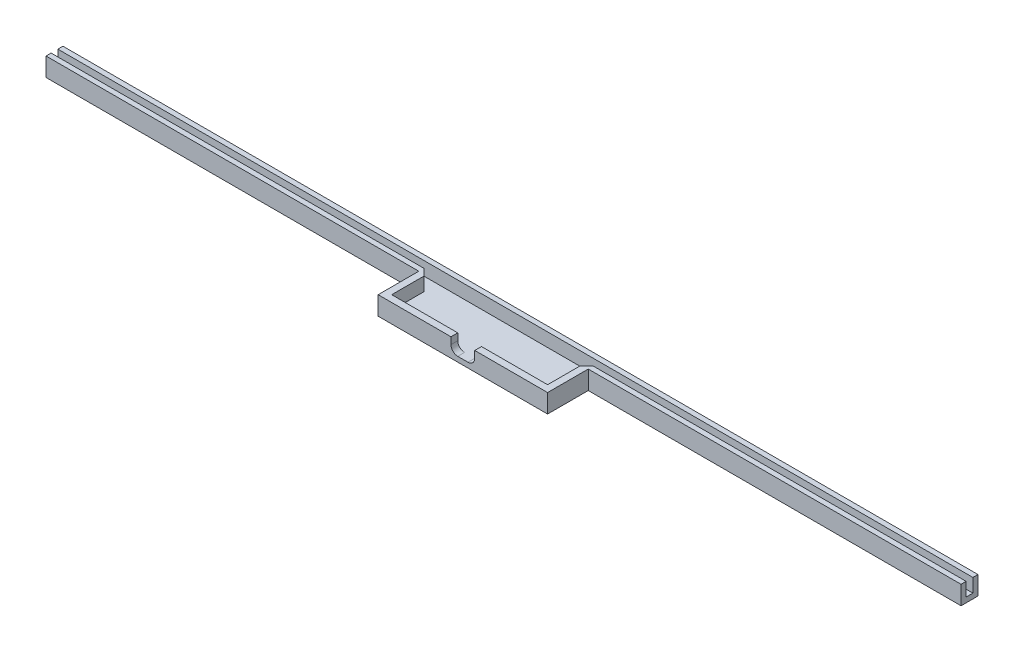
ISO-10303-21;
HEADER;
FILE_DESCRIPTION(('STEP AP214'),'2;1');
FILE_NAME('part.step','',(''),(''),'','','');
FILE_SCHEMA(('AUTOMOTIVE_DESIGN { 1 0 10303 214 1 1 1 1 }'));
ENDSEC;
DATA;
#1=APPLICATION_CONTEXT('core data for automotive mechanical design processes');
#2=APPLICATION_PROTOCOL_DEFINITION('international standard','automotive_design',2000,#1);
#3=PRODUCT_CONTEXT('',#1,'mechanical');
#4=PRODUCT('Part','Part','',(#3));
#5=PRODUCT_RELATED_PRODUCT_CATEGORY('part','',(#4));
#6=PRODUCT_DEFINITION_FORMATION('','',#4);
#7=PRODUCT_DEFINITION_CONTEXT('part definition',#1,'design');
#8=PRODUCT_DEFINITION('design','',#6,#7);
#9=PRODUCT_DEFINITION_SHAPE('','',#8);
#10=(LENGTH_UNIT() NAMED_UNIT(*) SI_UNIT(.MILLI.,.METRE.));
#11=(NAMED_UNIT(*) PLANE_ANGLE_UNIT() SI_UNIT($,.RADIAN.));
#12=(NAMED_UNIT(*) SI_UNIT($,.STERADIAN.) SOLID_ANGLE_UNIT());
#13=UNCERTAINTY_MEASURE_WITH_UNIT(LENGTH_MEASURE(1.E-05),#10,'distance_accuracy_value','');
#14=(GEOMETRIC_REPRESENTATION_CONTEXT(3) GLOBAL_UNCERTAINTY_ASSIGNED_CONTEXT((#13)) GLOBAL_UNIT_ASSIGNED_CONTEXT((#10,
#11,#12)) REPRESENTATION_CONTEXT('',''));
#15=CARTESIAN_POINT('',(0.,0.,0.));
#16=DIRECTION('',(0.,0.,1.));
#17=DIRECTION('',(1.,0.,0.));
#18=AXIS2_PLACEMENT_3D('',#15,#16,#17);
#19=CARTESIAN_POINT('',(0.,1.5,0.));
#20=DIRECTION('',(0.,-1.,0.));
#21=DIRECTION('',(0.,0.,-1.));
#22=AXIS2_PLACEMENT_3D('',#19,#20,#21);
#23=PLANE('',#22);
#24=DIRECTION('',(-1.,0.,0.));
#25=VECTOR('',#24,1.);
#26=CARTESIAN_POINT('',(-23.,1.5,6.5));
#27=LINE('',#26,#25);
#28=CARTESIAN_POINT('',(-1.5,1.5,6.5));
#29=VERTEX_POINT('',#28);
#30=CARTESIAN_POINT('',(-23.,1.5,6.5));
#31=VERTEX_POINT('',#30);
#32=EDGE_CURVE('E219',#29,#31,#27,.T.);
#33=ORIENTED_EDGE('',*,*,#32,.F.);
#34=DIRECTION('',(0.,0.,-1.));
#35=VECTOR('',#34,1.);
#36=CARTESIAN_POINT('',(-1.5,1.5,8.5));
#37=LINE('',#36,#35);
#38=CARTESIAN_POINT('',(-1.5,1.5,8.5));
#39=VERTEX_POINT('',#38);
#40=EDGE_CURVE('E372',#29,#39,#37,.F.);
#41=ORIENTED_EDGE('',*,*,#40,.T.);
#42=DIRECTION('',(1.,0.,0.));
#43=VECTOR('',#42,1.);
#44=CARTESIAN_POINT('',(-25.,1.5,8.5));
#45=LINE('',#44,#43);
#46=CARTESIAN_POINT('',(1.5,1.5,8.5));
#47=VERTEX_POINT('',#46);
#48=EDGE_CURVE('E306',#39,#47,#45,.T.);
#49=ORIENTED_EDGE('',*,*,#48,.T.);
#50=DIRECTION('',(0.,0.,1.));
#51=VECTOR('',#50,1.);
#52=CARTESIAN_POINT('',(1.5,1.5,6.5));
#53=LINE('',#52,#51);
#54=CARTESIAN_POINT('',(1.5,1.5,6.5));
#55=VERTEX_POINT('',#54);
#56=EDGE_CURVE('E369',#47,#55,#53,.F.);
#57=ORIENTED_EDGE('',*,*,#56,.T.);
#58=DIRECTION('',(-1.,0.,0.));
#59=VECTOR('',#58,1.);
#60=CARTESIAN_POINT('',(23.,1.5,6.5));
#61=LINE('',#60,#59);
#62=CARTESIAN_POINT('',(23.,1.5,6.5));
#63=VERTEX_POINT('',#62);
#64=EDGE_CURVE('E214',#63,#55,#61,.T.);
#65=ORIENTED_EDGE('',*,*,#64,.F.);
#66=DIRECTION('',(0.,0.,1.));
#67=VECTOR('',#66,1.);
#68=CARTESIAN_POINT('',(23.,1.5,-5.00000000000008));
#69=LINE('',#68,#67);
#70=CARTESIAN_POINT('',(23.,1.5,-3.00000000000011));
#71=VERTEX_POINT('',#70);
#72=EDGE_CURVE('E218',#71,#63,#69,.T.);
#73=ORIENTED_EDGE('',*,*,#72,.F.);
#74=DIRECTION('',(0.707106781186552,0.,-0.707106781186543));
#75=VECTOR('',#74,1.);
#76=CARTESIAN_POINT('',(9.99999999999978,1.5,9.99999999999992));
#77=LINE('',#76,#75);
#78=CARTESIAN_POINT('',(25.,1.5,-5.00000000000008));
#79=VERTEX_POINT('',#78);
#80=EDGE_CURVE('E362',#71,#79,#77,.T.);
#81=ORIENTED_EDGE('',*,*,#80,.T.);
#82=DIRECTION('',(1.,0.,0.));
#83=VECTOR('',#82,1.);
#84=CARTESIAN_POINT('',(135.,1.5,-5.00000000000005));
#85=LINE('',#84,#83);
#86=CARTESIAN_POINT('',(135.,1.5,-5.00000000000005));
#87=VERTEX_POINT('',#86);
#88=EDGE_CURVE('E254',#79,#87,#85,.T.);
#89=ORIENTED_EDGE('',*,*,#88,.T.);
#90=DIRECTION('',(0.,0.,-1.));
#91=VECTOR('',#90,1.);
#92=CARTESIAN_POINT('',(135.,1.5,-8.50000000000046));
#93=LINE('',#92,#91);
#94=CARTESIAN_POINT('',(135.,1.5,-7.0000000000005));
#95=VERTEX_POINT('',#94);
#96=EDGE_CURVE('E310',#87,#95,#93,.T.);
#97=ORIENTED_EDGE('',*,*,#96,.T.);
#98=DIRECTION('',(1.,0.,0.));
#99=VECTOR('',#98,1.);
#100=CARTESIAN_POINT('',(-135.,1.5,-7.00000000000045));
#101=LINE('',#100,#99);
#102=CARTESIAN_POINT('',(-135.,1.5,-7.00000000000047));
#103=VERTEX_POINT('',#102);
#104=EDGE_CURVE('E282',#103,#95,#101,.T.);
#105=ORIENTED_EDGE('',*,*,#104,.F.);
#106=DIRECTION('',(0.,0.,1.));
#107=VECTOR('',#106,1.);
#108=CARTESIAN_POINT('',(-135.,1.5,-8.50000000000047));
#109=LINE('',#108,#107);
#110=CARTESIAN_POINT('',(-135.,1.5,-5.00000000000008));
#111=VERTEX_POINT('',#110);
#112=EDGE_CURVE('E303',#103,#111,#109,.T.);
#113=ORIENTED_EDGE('',*,*,#112,.T.);
#114=DIRECTION('',(-1.,0.,0.));
#115=VECTOR('',#114,1.);
#116=CARTESIAN_POINT('',(-135.,1.5,-5.00000000000005));
#117=LINE('',#116,#115);
#118=CARTESIAN_POINT('',(-25.,1.5,-5.00000000000008));
#119=VERTEX_POINT('',#118);
#120=EDGE_CURVE('E269',#119,#111,#117,.T.);
#121=ORIENTED_EDGE('',*,*,#120,.F.);
#122=DIRECTION('',(-0.707106781186542,0.,-0.707106781186553));
#123=VECTOR('',#122,1.);
#124=CARTESIAN_POINT('',(-10.0000000000001,1.5,9.99999999999998));
#125=LINE('',#124,#123);
#126=CARTESIAN_POINT('',(-23.,1.5,-3.00000000000008));
#127=VERTEX_POINT('',#126);
#128=EDGE_CURVE('E364',#119,#127,#125,.F.);
#129=ORIENTED_EDGE('',*,*,#128,.T.);
#130=DIRECTION('',(0.,0.,-1.));
#131=VECTOR('',#130,1.);
#132=CARTESIAN_POINT('',(-23.,1.5,-5.00000000000008));
#133=LINE('',#132,#131);
#134=EDGE_CURVE('E244',#31,#127,#133,.T.);
#135=ORIENTED_EDGE('',*,*,#134,.F.);
#136=EDGE_LOOP('',(#33,#41,#49,#57,#65,#73,#81,#89,#97,#105,#113,#121,#129,#135));
#137=FACE_BOUND('',#136,.T.);
#138=ADVANCED_FACE('F33',(#137),#23,.F.);
#139=CARTESIAN_POINT('',(23.,5.5,-5.00000000000008));
#140=DIRECTION('',(1.,0.,0.));
#141=DIRECTION('',(0.,0.,-1.));
#142=AXIS2_PLACEMENT_3D('',#139,#140,#141);
#143=PLANE('',#142);
#144=DIRECTION('',(0.,0.,1.));
#145=VECTOR('',#144,1.);
#146=CARTESIAN_POINT('',(23.,5.5,-5.00000000000008));
#147=LINE('',#146,#145);
#148=CARTESIAN_POINT('',(23.,5.5,-3.00000000000011));
#149=VERTEX_POINT('',#148);
#150=CARTESIAN_POINT('',(23.,5.5,6.5));
#151=VERTEX_POINT('',#150);
#152=EDGE_CURVE('E192',#149,#151,#147,.T.);
#153=ORIENTED_EDGE('',*,*,#152,.F.);
#154=DIRECTION('',(0.,-1.,0.));
#155=VECTOR('',#154,1.);
#156=CARTESIAN_POINT('',(23.,1.5,-3.00000000000011));
#157=LINE('',#156,#155);
#158=EDGE_CURVE('E350',#149,#71,#157,.T.);
#159=ORIENTED_EDGE('',*,*,#158,.T.);
#160=ORIENTED_EDGE('',*,*,#72,.T.);
#161=DIRECTION('',(0.,-1.,0.));
#162=VECTOR('',#161,1.);
#163=CARTESIAN_POINT('',(23.,5.5,6.5));
#164=LINE('',#163,#162);
#165=EDGE_CURVE('E209',#151,#63,#164,.T.);
#166=ORIENTED_EDGE('',*,*,#165,.F.);
#167=EDGE_LOOP('',(#153,#159,#160,#166));
#168=FACE_BOUND('',#167,.T.);
#169=ADVANCED_FACE('F216',(#168),#143,.F.);
#170=CARTESIAN_POINT('',(-23.,5.5,-5.00000000000008));
#171=DIRECTION('',(-1.,0.,0.));
#172=DIRECTION('',(0.,0.,1.));
#173=AXIS2_PLACEMENT_3D('',#170,#171,#172);
#174=PLANE('',#173);
#175=ORIENTED_EDGE('',*,*,#134,.T.);
#176=DIRECTION('',(0.,1.,0.));
#177=VECTOR('',#176,1.);
#178=CARTESIAN_POINT('',(-23.,5.5,-3.00000000000008));
#179=LINE('',#178,#177);
#180=CARTESIAN_POINT('',(-23.,5.5,-3.00000000000008));
#181=VERTEX_POINT('',#180);
#182=EDGE_CURVE('E358',#127,#181,#179,.T.);
#183=ORIENTED_EDGE('',*,*,#182,.T.);
#184=DIRECTION('',(0.,0.,-1.));
#185=VECTOR('',#184,1.);
#186=CARTESIAN_POINT('',(-23.,5.5,-5.00000000000008));
#187=LINE('',#186,#185);
#188=CARTESIAN_POINT('',(-23.,5.5,6.5));
#189=VERTEX_POINT('',#188);
#190=EDGE_CURVE('E251',#189,#181,#187,.T.);
#191=ORIENTED_EDGE('',*,*,#190,.F.);
#192=DIRECTION('',(0.,-1.,0.));
#193=VECTOR('',#192,1.);
#194=CARTESIAN_POINT('',(-23.,5.5,6.5));
#195=LINE('',#194,#193);
#196=EDGE_CURVE('E230',#189,#31,#195,.T.);
#197=ORIENTED_EDGE('',*,*,#196,.T.);
#198=EDGE_LOOP('',(#175,#183,#191,#197));
#199=FACE_BOUND('',#198,.T.);
#200=ADVANCED_FACE('F417',(#199),#174,.F.);
#201=CARTESIAN_POINT('',(-135.,1.5,-8.50000000000047));
#202=DIRECTION('',(1.,0.,0.));
#203=DIRECTION('',(0.,0.,-1.));
#204=AXIS2_PLACEMENT_3D('',#201,#202,#203);
#205=PLANE('',#204);
#206=DIRECTION('',(0.,-1.,0.));
#207=VECTOR('',#206,1.);
#208=CARTESIAN_POINT('',(-135.,1.5,-8.50000000000047));
#209=LINE('',#208,#207);
#210=CARTESIAN_POINT('',(-135.,5.5,-8.50000000000047));
#211=VERTEX_POINT('',#210);
#212=CARTESIAN_POINT('',(-135.,0.,-8.50000000000047));
#213=VERTEX_POINT('',#212);
#214=EDGE_CURVE('E348',#211,#213,#209,.T.);
#215=ORIENTED_EDGE('',*,*,#214,.T.);
#216=DIRECTION('',(0.,0.,1.));
#217=VECTOR('',#216,1.);
#218=CARTESIAN_POINT('',(-135.,0.,-8.50000000000047));
#219=LINE('',#218,#217);
#220=CARTESIAN_POINT('',(-135.,0.,-3.50000000000047));
#221=VERTEX_POINT('',#220);
#222=EDGE_CURVE('E302',#213,#221,#219,.T.);
#223=ORIENTED_EDGE('',*,*,#222,.T.);
#224=DIRECTION('',(0.,-1.,0.));
#225=VECTOR('',#224,1.);
#226=CARTESIAN_POINT('',(-135.,1.5,-3.50000000000047));
#227=LINE('',#226,#225);
#228=CARTESIAN_POINT('',(-135.,5.5,-3.50000000000047));
#229=VERTEX_POINT('',#228);
#230=EDGE_CURVE('E345',#229,#221,#227,.T.);
#231=ORIENTED_EDGE('',*,*,#230,.F.);
#232=DIRECTION('',(0.,0.,1.));
#233=VECTOR('',#232,1.);
#234=CARTESIAN_POINT('',(-135.,5.5,-5.00000000000005));
#235=LINE('',#234,#233);
#236=CARTESIAN_POINT('',(-135.,5.5,-5.00000000000005));
#237=VERTEX_POINT('',#236);
#238=EDGE_CURVE('E270',#237,#229,#235,.T.);
#239=ORIENTED_EDGE('',*,*,#238,.F.);
#240=DIRECTION('',(0.,-1.,0.));
#241=VECTOR('',#240,1.);
#242=CARTESIAN_POINT('',(-135.,5.5,-5.00000000000005));
#243=LINE('',#242,#241);
#244=EDGE_CURVE('E278',#237,#111,#243,.T.);
#245=ORIENTED_EDGE('',*,*,#244,.T.);
#246=ORIENTED_EDGE('',*,*,#112,.F.);
#247=DIRECTION('',(0.,-1.,0.));
#248=VECTOR('',#247,1.);
#249=CARTESIAN_POINT('',(-135.,5.5,-7.00000000000045));
#250=LINE('',#249,#248);
#251=CARTESIAN_POINT('',(-135.,5.5,-7.00000000000045));
#252=VERTEX_POINT('',#251);
#253=EDGE_CURVE('E299',#252,#103,#250,.T.);
#254=ORIENTED_EDGE('',*,*,#253,.F.);
#255=DIRECTION('',(0.,0.,1.));
#256=VECTOR('',#255,1.);
#257=CARTESIAN_POINT('',(-135.,5.5,-8.50000000000047));
#258=LINE('',#257,#256);
#259=EDGE_CURVE('E283',#211,#252,#258,.T.);
#260=ORIENTED_EDGE('',*,*,#259,.F.);
#261=EDGE_LOOP('',(#215,#223,#231,#239,#245,#246,#254,#260));
#262=FACE_BOUND('',#261,.T.);
#263=ADVANCED_FACE('F451',(#262),#205,.F.);
#264=CARTESIAN_POINT('',(-135.,1.5,-3.50000000000047));
#265=DIRECTION('',(0.,0.,-1.));
#266=DIRECTION('',(-1.,0.,0.));
#267=AXIS2_PLACEMENT_3D('',#264,#265,#266);
#268=PLANE('',#267);
#269=DIRECTION('',(1.,0.,0.));
#270=VECTOR('',#269,1.);
#271=CARTESIAN_POINT('',(-135.,0.,-3.50000000000047));
#272=LINE('',#271,#270);
#273=CARTESIAN_POINT('',(-25.,0.,-3.50000000000006));
#274=VERTEX_POINT('',#273);
#275=EDGE_CURVE('E314',#221,#274,#272,.T.);
#276=ORIENTED_EDGE('',*,*,#275,.T.);
#277=DIRECTION('',(0.,-1.,0.));
#278=VECTOR('',#277,1.);
#279=CARTESIAN_POINT('',(-25.,1.5,-3.50000000000006));
#280=LINE('',#279,#278);
#281=CARTESIAN_POINT('',(-25.,5.5,-3.50000000000006));
#282=VERTEX_POINT('',#281);
#283=EDGE_CURVE('E342',#282,#274,#280,.T.);
#284=ORIENTED_EDGE('',*,*,#283,.F.);
#285=DIRECTION('',(1.,0.,0.));
#286=VECTOR('',#285,1.);
#287=CARTESIAN_POINT('',(-25.,5.5,-3.50000000000006));
#288=LINE('',#287,#286);
#289=EDGE_CURVE('E273',#229,#282,#288,.T.);
#290=ORIENTED_EDGE('',*,*,#289,.F.);
#291=ORIENTED_EDGE('',*,*,#230,.T.);
#292=EDGE_LOOP('',(#276,#284,#290,#291));
#293=FACE_BOUND('',#292,.T.);
#294=ADVANCED_FACE('F448',(#293),#268,.F.);
#295=CARTESIAN_POINT('',(-25.,1.5,8.5));
#296=DIRECTION('',(1.,0.,0.));
#297=DIRECTION('',(0.,0.,-1.));
#298=AXIS2_PLACEMENT_3D('',#295,#296,#297);
#299=PLANE('',#298);
#300=DIRECTION('',(0.,0.,1.));
#301=VECTOR('',#300,1.);
#302=CARTESIAN_POINT('',(-25.,0.,8.5));
#303=LINE('',#302,#301);
#304=CARTESIAN_POINT('',(-25.,0.,8.5));
#305=VERTEX_POINT('',#304);
#306=EDGE_CURVE('E316',#274,#305,#303,.T.);
#307=ORIENTED_EDGE('',*,*,#306,.T.);
#308=DIRECTION('',(0.,-1.,0.));
#309=VECTOR('',#308,1.);
#310=CARTESIAN_POINT('',(-25.,1.5,8.5));
#311=LINE('',#310,#309);
#312=CARTESIAN_POINT('',(-25.,5.5,8.5));
#313=VERTEX_POINT('',#312);
#314=EDGE_CURVE('E339',#313,#305,#311,.T.);
#315=ORIENTED_EDGE('',*,*,#314,.F.);
#316=DIRECTION('',(0.,0.,1.));
#317=VECTOR('',#316,1.);
#318=CARTESIAN_POINT('',(-25.,5.5,-5.00000000000008));
#319=LINE('',#318,#317);
#320=EDGE_CURVE('E246',#282,#313,#319,.T.);
#321=ORIENTED_EDGE('',*,*,#320,.F.);
#322=ORIENTED_EDGE('',*,*,#283,.T.);
#323=EDGE_LOOP('',(#307,#315,#321,#322));
#324=FACE_BOUND('',#323,.T.);
#325=ADVANCED_FACE('F445',(#324),#299,.F.);
#326=CARTESIAN_POINT('',(-25.,1.5,8.5));
#327=DIRECTION('',(0.,0.,-1.));
#328=DIRECTION('',(-1.,0.,0.));
#329=AXIS2_PLACEMENT_3D('',#326,#327,#328);
#330=PLANE('',#329);
#331=ORIENTED_EDGE('',*,*,#48,.F.);
#332=CARTESIAN_POINT('',(-1.5,3.5,8.5));
#333=DIRECTION('',(0.,0.,-1.));
#334=DIRECTION('',(-1.,0.,0.));
#335=AXIS2_PLACEMENT_3D('',#332,#333,#334);
#336=CIRCLE('',#335,2.);
#337=CARTESIAN_POINT('',(-3.5,3.5,8.5));
#338=VERTEX_POINT('',#337);
#339=EDGE_CURVE('E379',#39,#338,#336,.T.);
#340=ORIENTED_EDGE('',*,*,#339,.T.);
#341=DIRECTION('',(0.,-1.,0.));
#342=VECTOR('',#341,1.);
#343=CARTESIAN_POINT('',(-3.5,5.5,8.5));
#344=LINE('',#343,#342);
#345=CARTESIAN_POINT('',(-3.5,5.5,8.5));
#346=VERTEX_POINT('',#345);
#347=EDGE_CURVE('E237',#346,#338,#344,.T.);
#348=ORIENTED_EDGE('',*,*,#347,.F.);
#349=DIRECTION('',(1.,0.,0.));
#350=VECTOR('',#349,1.);
#351=CARTESIAN_POINT('',(-25.,5.5,8.5));
#352=LINE('',#351,#350);
#353=EDGE_CURVE('E249',#313,#346,#352,.T.);
#354=ORIENTED_EDGE('',*,*,#353,.F.);
#355=ORIENTED_EDGE('',*,*,#314,.T.);
#356=DIRECTION('',(1.,0.,0.));
#357=VECTOR('',#356,1.);
#358=CARTESIAN_POINT('',(-25.,0.,8.5));
#359=LINE('',#358,#357);
#360=CARTESIAN_POINT('',(25.,0.,8.5));
#361=VERTEX_POINT('',#360);
#362=EDGE_CURVE('E318',#305,#361,#359,.T.);
#363=ORIENTED_EDGE('',*,*,#362,.T.);
#364=DIRECTION('',(0.,-1.,0.));
#365=VECTOR('',#364,1.);
#366=CARTESIAN_POINT('',(25.,1.5,8.5));
#367=LINE('',#366,#365);
#368=CARTESIAN_POINT('',(25.,5.5,8.5));
#369=VERTEX_POINT('',#368);
#370=EDGE_CURVE('E336',#369,#361,#367,.T.);
#371=ORIENTED_EDGE('',*,*,#370,.F.);
#372=DIRECTION('',(1.,0.,0.));
#373=VECTOR('',#372,1.);
#374=CARTESIAN_POINT('',(25.,5.5,8.5));
#375=LINE('',#374,#373);
#376=CARTESIAN_POINT('',(3.5,5.5,8.5));
#377=VERTEX_POINT('',#376);
#378=EDGE_CURVE('E204',#377,#369,#375,.T.);
#379=ORIENTED_EDGE('',*,*,#378,.F.);
#380=DIRECTION('',(0.,-1.,0.));
#381=VECTOR('',#380,1.);
#382=CARTESIAN_POINT('',(3.5,5.5,8.5));
#383=LINE('',#382,#381);
#384=CARTESIAN_POINT('',(3.5,3.5,8.5));
#385=VERTEX_POINT('',#384);
#386=EDGE_CURVE('E223',#377,#385,#383,.T.);
#387=ORIENTED_EDGE('',*,*,#386,.T.);
#388=CARTESIAN_POINT('',(1.5,3.5,8.5));
#389=DIRECTION('',(0.,0.,-1.));
#390=DIRECTION('',(-1.,0.,0.));
#391=AXIS2_PLACEMENT_3D('',#388,#389,#390);
#392=CIRCLE('',#391,2.);
#393=EDGE_CURVE('E41',#385,#47,#392,.T.);
#394=ORIENTED_EDGE('',*,*,#393,.T.);
#395=EDGE_LOOP('',(#331,#340,#348,#354,#355,#363,#371,#379,#387,#394));
#396=FACE_BOUND('',#395,.T.);
#397=ADVANCED_FACE('F383',(#396),#330,.F.);
#398=CARTESIAN_POINT('',(25.,1.5,8.5));
#399=DIRECTION('',(-1.,0.,0.));
#400=DIRECTION('',(0.,0.,1.));
#401=AXIS2_PLACEMENT_3D('',#398,#399,#400);
#402=PLANE('',#401);
#403=DIRECTION('',(0.,0.,-1.));
#404=VECTOR('',#403,1.);
#405=CARTESIAN_POINT('',(25.,0.,8.5));
#406=LINE('',#405,#404);
#407=CARTESIAN_POINT('',(25.,0.,-3.50000000000005));
#408=VERTEX_POINT('',#407);
#409=EDGE_CURVE('E320',#361,#408,#406,.T.);
#410=ORIENTED_EDGE('',*,*,#409,.T.);
#411=DIRECTION('',(0.,-1.,0.));
#412=VECTOR('',#411,1.);
#413=CARTESIAN_POINT('',(25.,1.5,-3.50000000000005));
#414=LINE('',#413,#412);
#415=CARTESIAN_POINT('',(25.,5.5,-3.50000000000006));
#416=VERTEX_POINT('',#415);
#417=EDGE_CURVE('E333',#416,#408,#414,.T.);
#418=ORIENTED_EDGE('',*,*,#417,.F.);
#419=DIRECTION('',(0.,0.,-1.));
#420=VECTOR('',#419,1.);
#421=CARTESIAN_POINT('',(25.,5.5,-5.00000000000008));
#422=LINE('',#421,#420);
#423=EDGE_CURVE('E205',#369,#416,#422,.T.);
#424=ORIENTED_EDGE('',*,*,#423,.F.);
#425=ORIENTED_EDGE('',*,*,#370,.T.);
#426=EDGE_LOOP('',(#410,#418,#424,#425));
#427=FACE_BOUND('',#426,.T.);
#428=ADVANCED_FACE('F438',(#427),#402,.F.);
#429=CARTESIAN_POINT('',(135.,1.5,-3.50000000000046));
#430=DIRECTION('',(0.,0.,-1.));
#431=DIRECTION('',(-1.,0.,0.));
#432=AXIS2_PLACEMENT_3D('',#429,#430,#431);
#433=PLANE('',#432);
#434=DIRECTION('',(1.,0.,0.));
#435=VECTOR('',#434,1.);
#436=CARTESIAN_POINT('',(135.,0.,-3.50000000000046));
#437=LINE('',#436,#435);
#438=CARTESIAN_POINT('',(135.,0.,-3.50000000000046));
#439=VERTEX_POINT('',#438);
#440=EDGE_CURVE('E322',#408,#439,#437,.T.);
#441=ORIENTED_EDGE('',*,*,#440,.T.);
#442=DIRECTION('',(0.,-1.,0.));
#443=VECTOR('',#442,1.);
#444=CARTESIAN_POINT('',(135.,1.5,-3.50000000000046));
#445=LINE('',#444,#443);
#446=CARTESIAN_POINT('',(135.,5.5,-3.50000000000047));
#447=VERTEX_POINT('',#446);
#448=EDGE_CURVE('E330',#447,#439,#445,.T.);
#449=ORIENTED_EDGE('',*,*,#448,.F.);
#450=DIRECTION('',(-1.,0.,0.));
#451=VECTOR('',#450,1.);
#452=CARTESIAN_POINT('',(25.,5.5,-3.50000000000006));
#453=LINE('',#452,#451);
#454=EDGE_CURVE('E262',#447,#416,#453,.T.);
#455=ORIENTED_EDGE('',*,*,#454,.T.);
#456=ORIENTED_EDGE('',*,*,#417,.T.);
#457=EDGE_LOOP('',(#441,#449,#455,#456));
#458=FACE_BOUND('',#457,.T.);
#459=ADVANCED_FACE('F434',(#458),#433,.F.);
#460=CARTESIAN_POINT('',(135.,1.5,-8.50000000000046));
#461=DIRECTION('',(-1.,0.,0.));
#462=DIRECTION('',(0.,0.,1.));
#463=AXIS2_PLACEMENT_3D('',#460,#461,#462);
#464=PLANE('',#463);
#465=DIRECTION('',(0.,-1.,0.));
#466=VECTOR('',#465,1.);
#467=CARTESIAN_POINT('',(135.,5.5,-7.0000000000005));
#468=LINE('',#467,#466);
#469=CARTESIAN_POINT('',(135.,5.5,-7.0000000000005));
#470=VERTEX_POINT('',#469);
#471=EDGE_CURVE('E294',#470,#95,#468,.T.);
#472=ORIENTED_EDGE('',*,*,#471,.T.);
#473=ORIENTED_EDGE('',*,*,#96,.F.);
#474=DIRECTION('',(0.,-1.,0.));
#475=VECTOR('',#474,1.);
#476=CARTESIAN_POINT('',(135.,5.5,-5.00000000000005));
#477=LINE('',#476,#475);
#478=CARTESIAN_POINT('',(135.,5.5,-5.00000000000005));
#479=VERTEX_POINT('',#478);
#480=EDGE_CURVE('E265',#479,#87,#477,.T.);
#481=ORIENTED_EDGE('',*,*,#480,.F.);
#482=DIRECTION('',(0.,0.,1.));
#483=VECTOR('',#482,1.);
#484=CARTESIAN_POINT('',(135.,5.5,-5.00000000000005));
#485=LINE('',#484,#483);
#486=EDGE_CURVE('E257',#479,#447,#485,.T.);
#487=ORIENTED_EDGE('',*,*,#486,.T.);
#488=ORIENTED_EDGE('',*,*,#448,.T.);
#489=DIRECTION('',(0.,0.,-1.));
#490=VECTOR('',#489,1.);
#491=CARTESIAN_POINT('',(135.,0.,-8.50000000000046));
#492=LINE('',#491,#490);
#493=CARTESIAN_POINT('',(135.,0.,-8.50000000000046));
#494=VERTEX_POINT('',#493);
#495=EDGE_CURVE('E324',#439,#494,#492,.T.);
#496=ORIENTED_EDGE('',*,*,#495,.T.);
#497=DIRECTION('',(0.,-1.,0.));
#498=VECTOR('',#497,1.);
#499=CARTESIAN_POINT('',(135.,1.5,-8.50000000000046));
#500=LINE('',#499,#498);
#501=CARTESIAN_POINT('',(135.,5.5,-8.50000000000046));
#502=VERTEX_POINT('',#501);
#503=EDGE_CURVE('E312',#502,#494,#500,.T.);
#504=ORIENTED_EDGE('',*,*,#503,.F.);
#505=DIRECTION('',(0.,0.,-1.));
#506=VECTOR('',#505,1.);
#507=CARTESIAN_POINT('',(135.,5.5,-7.0000000000005));
#508=LINE('',#507,#506);
#509=EDGE_CURVE('E288',#470,#502,#508,.T.);
#510=ORIENTED_EDGE('',*,*,#509,.F.);
#511=EDGE_LOOP('',(#472,#473,#481,#487,#488,#496,#504,#510));
#512=FACE_BOUND('',#511,.T.);
#513=ADVANCED_FACE('F430',(#512),#464,.F.);
#514=CARTESIAN_POINT('',(25.,1.5,-8.5));
#515=DIRECTION('',(0.,0.,1.));
#516=DIRECTION('',(1.,0.,0.));
#517=AXIS2_PLACEMENT_3D('',#514,#515,#516);
#518=PLANE('',#517);
#519=ORIENTED_EDGE('',*,*,#503,.T.);
#520=DIRECTION('',(-1.,0.,0.));
#521=VECTOR('',#520,1.);
#522=CARTESIAN_POINT('',(25.,0.,-8.5));
#523=LINE('',#522,#521);
#524=EDGE_CURVE('E307',#494,#213,#523,.T.);
#525=ORIENTED_EDGE('',*,*,#524,.T.);
#526=ORIENTED_EDGE('',*,*,#214,.F.);
#527=DIRECTION('',(-1.,0.,0.));
#528=VECTOR('',#527,1.);
#529=CARTESIAN_POINT('',(135.,5.5,-8.50000000000046));
#530=LINE('',#529,#528);
#531=EDGE_CURVE('E291',#502,#211,#530,.T.);
#532=ORIENTED_EDGE('',*,*,#531,.F.);
#533=EDGE_LOOP('',(#519,#525,#526,#532));
#534=FACE_BOUND('',#533,.T.);
#535=ADVANCED_FACE('F426',(#534),#518,.F.);
#536=CARTESIAN_POINT('',(0.,0.,0.));
#537=DIRECTION('',(0.,-1.,0.));
#538=DIRECTION('',(0.,0.,-1.));
#539=AXIS2_PLACEMENT_3D('',#536,#537,#538);
#540=PLANE('',#539);
#541=ORIENTED_EDGE('',*,*,#222,.F.);
#542=ORIENTED_EDGE('',*,*,#524,.F.);
#543=ORIENTED_EDGE('',*,*,#495,.F.);
#544=ORIENTED_EDGE('',*,*,#440,.F.);
#545=ORIENTED_EDGE('',*,*,#409,.F.);
#546=ORIENTED_EDGE('',*,*,#362,.F.);
#547=ORIENTED_EDGE('',*,*,#306,.F.);
#548=ORIENTED_EDGE('',*,*,#275,.F.);
#549=EDGE_LOOP('',(#541,#542,#543,#544,#545,#546,#547,#548));
#550=FACE_BOUND('',#549,.T.);
#551=ADVANCED_FACE('F423',(#550),#540,.T.);
#552=CARTESIAN_POINT('',(-135.,5.5,-7.00000000000045));
#553=DIRECTION('',(0.,0.,-1.));
#554=DIRECTION('',(-1.,0.,0.));
#555=AXIS2_PLACEMENT_3D('',#552,#553,#554);
#556=PLANE('',#555);
#557=ORIENTED_EDGE('',*,*,#104,.T.);
#558=ORIENTED_EDGE('',*,*,#471,.F.);
#559=DIRECTION('',(1.,0.,0.));
#560=VECTOR('',#559,1.);
#561=CARTESIAN_POINT('',(-135.,5.5,-7.00000000000045));
#562=LINE('',#561,#560);
#563=EDGE_CURVE('E286',#252,#470,#562,.T.);
#564=ORIENTED_EDGE('',*,*,#563,.F.);
#565=ORIENTED_EDGE('',*,*,#253,.T.);
#566=EDGE_LOOP('',(#557,#558,#564,#565));
#567=FACE_BOUND('',#566,.T.);
#568=ADVANCED_FACE('F421',(#567),#556,.F.);
#569=CARTESIAN_POINT('',(0.,5.5,0.));
#570=DIRECTION('',(0.,1.,0.));
#571=DIRECTION('',(0.,0.,1.));
#572=AXIS2_PLACEMENT_3D('',#569,#570,#571);
#573=PLANE('',#572);
#574=ORIENTED_EDGE('',*,*,#259,.T.);
#575=ORIENTED_EDGE('',*,*,#563,.T.);
#576=ORIENTED_EDGE('',*,*,#509,.T.);
#577=ORIENTED_EDGE('',*,*,#531,.T.);
#578=EDGE_LOOP('',(#574,#575,#576,#577));
#579=FACE_BOUND('',#578,.T.);
#580=ADVANCED_FACE('F486',(#579),#573,.T.);
#581=CARTESIAN_POINT('',(-135.,5.5,-5.00000000000005));
#582=DIRECTION('',(0.,0.,1.));
#583=DIRECTION('',(1.,0.,0.));
#584=AXIS2_PLACEMENT_3D('',#581,#582,#583);
#585=PLANE('',#584);
#586=DIRECTION('',(-1.,0.,0.));
#587=VECTOR('',#586,1.);
#588=CARTESIAN_POINT('',(-135.,5.5,-5.00000000000005));
#589=LINE('',#588,#587);
#590=CARTESIAN_POINT('',(-25.,5.5,-5.00000000000008));
#591=VERTEX_POINT('',#590);
#592=EDGE_CURVE('E276',#591,#237,#589,.T.);
#593=ORIENTED_EDGE('',*,*,#592,.F.);
#594=DIRECTION('',(0.,-1.,0.));
#595=VECTOR('',#594,1.);
#596=CARTESIAN_POINT('',(-25.,5.5,-5.00000000000008));
#597=LINE('',#596,#595);
#598=EDGE_CURVE('E355',#591,#119,#597,.T.);
#599=ORIENTED_EDGE('',*,*,#598,.T.);
#600=ORIENTED_EDGE('',*,*,#120,.T.);
#601=ORIENTED_EDGE('',*,*,#244,.F.);
#602=EDGE_LOOP('',(#593,#599,#600,#601));
#603=FACE_BOUND('',#602,.T.);
#604=ADVANCED_FACE('F479',(#603),#585,.F.);
#605=CARTESIAN_POINT('',(0.,5.5,0.));
#606=DIRECTION('',(0.,-1.,0.));
#607=DIRECTION('',(0.,0.,-1.));
#608=AXIS2_PLACEMENT_3D('',#605,#606,#607);
#609=PLANE('',#608);
#610=ORIENTED_EDGE('',*,*,#190,.T.);
#611=DIRECTION('',(0.707106781186542,0.,0.707106781186553));
#612=VECTOR('',#611,1.);
#613=CARTESIAN_POINT('',(-25.,5.5,-5.00000000000008));
#614=LINE('',#613,#612);
#615=EDGE_CURVE('E360',#181,#591,#614,.F.);
#616=ORIENTED_EDGE('',*,*,#615,.T.);
#617=ORIENTED_EDGE('',*,*,#592,.T.);
#618=ORIENTED_EDGE('',*,*,#238,.T.);
#619=ORIENTED_EDGE('',*,*,#289,.T.);
#620=ORIENTED_EDGE('',*,*,#320,.T.);
#621=ORIENTED_EDGE('',*,*,#353,.T.);
#622=DIRECTION('',(0.,0.,-1.));
#623=VECTOR('',#622,1.);
#624=CARTESIAN_POINT('',(-3.5,5.5,8.5));
#625=LINE('',#624,#623);
#626=CARTESIAN_POINT('',(-3.5,5.5,6.5));
#627=VERTEX_POINT('',#626);
#628=EDGE_CURVE('E221',#346,#627,#625,.T.);
#629=ORIENTED_EDGE('',*,*,#628,.T.);
#630=DIRECTION('',(-1.,0.,0.));
#631=VECTOR('',#630,1.);
#632=CARTESIAN_POINT('',(-23.,5.5,6.5));
#633=LINE('',#632,#631);
#634=EDGE_CURVE('E228',#627,#189,#633,.T.);
#635=ORIENTED_EDGE('',*,*,#634,.T.);
#636=EDGE_LOOP('',(#610,#616,#617,#618,#619,#620,#621,#629,#635));
#637=FACE_BOUND('',#636,.T.);
#638=ADVANCED_FACE('F473',(#637),#609,.F.);
#639=CARTESIAN_POINT('',(135.,5.5,-5.00000000000005));
#640=DIRECTION('',(0.,0.,-1.));
#641=DIRECTION('',(-1.,0.,0.));
#642=AXIS2_PLACEMENT_3D('',#639,#640,#641);
#643=PLANE('',#642);
#644=ORIENTED_EDGE('',*,*,#88,.F.);
#645=DIRECTION('',(0.,1.,0.));
#646=VECTOR('',#645,1.);
#647=CARTESIAN_POINT('',(25.,5.5,-5.00000000000008));
#648=LINE('',#647,#646);
#649=CARTESIAN_POINT('',(25.,5.5,-5.00000000000008));
#650=VERTEX_POINT('',#649);
#651=EDGE_CURVE('E352',#79,#650,#648,.T.);
#652=ORIENTED_EDGE('',*,*,#651,.T.);
#653=DIRECTION('',(1.,0.,0.));
#654=VECTOR('',#653,1.);
#655=CARTESIAN_POINT('',(135.,5.5,-5.00000000000005));
#656=LINE('',#655,#654);
#657=EDGE_CURVE('E260',#650,#479,#656,.T.);
#658=ORIENTED_EDGE('',*,*,#657,.T.);
#659=ORIENTED_EDGE('',*,*,#480,.T.);
#660=EDGE_LOOP('',(#644,#652,#658,#659));
#661=FACE_BOUND('',#660,.T.);
#662=ADVANCED_FACE('F397',(#661),#643,.T.);
#663=CARTESIAN_POINT('',(0.,5.5,0.));
#664=DIRECTION('',(0.,-1.,0.));
#665=DIRECTION('',(0.,0.,-1.));
#666=AXIS2_PLACEMENT_3D('',#663,#664,#665);
#667=PLANE('',#666);
#668=ORIENTED_EDGE('',*,*,#657,.F.);
#669=DIRECTION('',(-0.707106781186552,0.,0.707106781186543));
#670=VECTOR('',#669,1.);
#671=CARTESIAN_POINT('',(23.,5.5,-3.00000000000011));
#672=LINE('',#671,#670);
#673=EDGE_CURVE('E199',#650,#149,#672,.T.);
#674=ORIENTED_EDGE('',*,*,#673,.T.);
#675=ORIENTED_EDGE('',*,*,#152,.T.);
#676=DIRECTION('',(-1.,0.,0.));
#677=VECTOR('',#676,1.);
#678=CARTESIAN_POINT('',(23.,5.5,6.5));
#679=LINE('',#678,#677);
#680=CARTESIAN_POINT('',(3.5,5.5,6.5));
#681=VERTEX_POINT('',#680);
#682=EDGE_CURVE('E197',#151,#681,#679,.T.);
#683=ORIENTED_EDGE('',*,*,#682,.T.);
#684=DIRECTION('',(0.,0.,1.));
#685=VECTOR('',#684,1.);
#686=CARTESIAN_POINT('',(3.5,5.5,8.5));
#687=LINE('',#686,#685);
#688=EDGE_CURVE('E213',#681,#377,#687,.T.);
#689=ORIENTED_EDGE('',*,*,#688,.T.);
#690=ORIENTED_EDGE('',*,*,#378,.T.);
#691=ORIENTED_EDGE('',*,*,#423,.T.);
#692=ORIENTED_EDGE('',*,*,#454,.F.);
#693=ORIENTED_EDGE('',*,*,#486,.F.);
#694=EDGE_LOOP('',(#668,#674,#675,#683,#689,#690,#691,#692,#693));
#695=FACE_BOUND('',#694,.T.);
#696=ADVANCED_FACE('F195',(#695),#667,.F.);
#697=CARTESIAN_POINT('',(-3.5,5.5,8.5));
#698=DIRECTION('',(-1.,0.,0.));
#699=DIRECTION('',(0.,0.,1.));
#700=AXIS2_PLACEMENT_3D('',#697,#698,#699);
#701=PLANE('',#700);
#702=ORIENTED_EDGE('',*,*,#347,.T.);
#703=DIRECTION('',(0.,0.,-1.));
#704=VECTOR('',#703,1.);
#705=CARTESIAN_POINT('',(-3.5,3.5,6.5));
#706=LINE('',#705,#704);
#707=CARTESIAN_POINT('',(-3.5,3.5,6.5));
#708=VERTEX_POINT('',#707);
#709=EDGE_CURVE('E366',#338,#708,#706,.T.);
#710=ORIENTED_EDGE('',*,*,#709,.T.);
#711=DIRECTION('',(0.,-1.,0.));
#712=VECTOR('',#711,1.);
#713=CARTESIAN_POINT('',(-3.5,5.5,6.5));
#714=LINE('',#713,#712);
#715=EDGE_CURVE('E234',#627,#708,#714,.T.);
#716=ORIENTED_EDGE('',*,*,#715,.F.);
#717=ORIENTED_EDGE('',*,*,#628,.F.);
#718=EDGE_LOOP('',(#702,#710,#716,#717));
#719=FACE_BOUND('',#718,.T.);
#720=ADVANCED_FACE('F499',(#719),#701,.F.);
#721=CARTESIAN_POINT('',(-23.,5.5,6.5));
#722=DIRECTION('',(0.,0.,1.));
#723=DIRECTION('',(1.,0.,0.));
#724=AXIS2_PLACEMENT_3D('',#721,#722,#723);
#725=PLANE('',#724);
#726=ORIENTED_EDGE('',*,*,#32,.T.);
#727=ORIENTED_EDGE('',*,*,#196,.F.);
#728=ORIENTED_EDGE('',*,*,#634,.F.);
#729=ORIENTED_EDGE('',*,*,#715,.T.);
#730=CARTESIAN_POINT('',(-1.5,3.5,6.5));
#731=DIRECTION('',(0.,0.,1.));
#732=DIRECTION('',(1.,0.,0.));
#733=AXIS2_PLACEMENT_3D('',#730,#731,#732);
#734=CIRCLE('',#733,2.);
#735=EDGE_CURVE('E376',#708,#29,#734,.T.);
#736=ORIENTED_EDGE('',*,*,#735,.T.);
#737=EDGE_LOOP('',(#726,#727,#728,#729,#736));
#738=FACE_BOUND('',#737,.T.);
#739=ADVANCED_FACE('F503',(#738),#725,.F.);
#740=CARTESIAN_POINT('',(23.,5.5,6.5));
#741=DIRECTION('',(0.,0.,1.));
#742=DIRECTION('',(1.,0.,0.));
#743=AXIS2_PLACEMENT_3D('',#740,#741,#742);
#744=PLANE('',#743);
#745=ORIENTED_EDGE('',*,*,#64,.T.);
#746=CARTESIAN_POINT('',(1.5,3.5,6.5));
#747=DIRECTION('',(0.,0.,1.));
#748=DIRECTION('',(1.,0.,0.));
#749=AXIS2_PLACEMENT_3D('',#746,#747,#748);
#750=CIRCLE('',#749,2.);
#751=CARTESIAN_POINT('',(3.5,3.5,6.5));
#752=VERTEX_POINT('',#751);
#753=EDGE_CURVE('E11',#55,#752,#750,.T.);
#754=ORIENTED_EDGE('',*,*,#753,.T.);
#755=DIRECTION('',(0.,-1.,0.));
#756=VECTOR('',#755,1.);
#757=CARTESIAN_POINT('',(3.5,5.5,6.5));
#758=LINE('',#757,#756);
#759=EDGE_CURVE('E211',#681,#752,#758,.T.);
#760=ORIENTED_EDGE('',*,*,#759,.F.);
#761=ORIENTED_EDGE('',*,*,#682,.F.);
#762=ORIENTED_EDGE('',*,*,#165,.T.);
#763=EDGE_LOOP('',(#745,#754,#760,#761,#762));
#764=FACE_BOUND('',#763,.T.);
#765=ADVANCED_FACE('F208',(#764),#744,.F.);
#766=CARTESIAN_POINT('',(3.5,5.5,8.5));
#767=DIRECTION('',(1.,0.,0.));
#768=DIRECTION('',(0.,0.,-1.));
#769=AXIS2_PLACEMENT_3D('',#766,#767,#768);
#770=PLANE('',#769);
#771=ORIENTED_EDGE('',*,*,#759,.T.);
#772=DIRECTION('',(0.,0.,1.));
#773=VECTOR('',#772,1.);
#774=CARTESIAN_POINT('',(3.5,3.5,8.5));
#775=LINE('',#774,#773);
#776=EDGE_CURVE('E374',#752,#385,#775,.T.);
#777=ORIENTED_EDGE('',*,*,#776,.T.);
#778=ORIENTED_EDGE('',*,*,#386,.F.);
#779=ORIENTED_EDGE('',*,*,#688,.F.);
#780=EDGE_LOOP('',(#771,#777,#778,#779));
#781=FACE_BOUND('',#780,.T.);
#782=ADVANCED_FACE('F389',(#781),#770,.F.);
#783=CARTESIAN_POINT('',(23.,5.5,-3.00000000000011));
#784=DIRECTION('',(-0.707106781186543,0.,-0.707106781186552));
#785=DIRECTION('',(0.,1.,0.));
#786=AXIS2_PLACEMENT_3D('',#783,#784,#785);
#787=PLANE('',#786);
#788=ORIENTED_EDGE('',*,*,#673,.F.);
#789=ORIENTED_EDGE('',*,*,#651,.F.);
#790=ORIENTED_EDGE('',*,*,#80,.F.);
#791=ORIENTED_EDGE('',*,*,#158,.F.);
#792=EDGE_LOOP('',(#788,#789,#790,#791));
#793=FACE_BOUND('',#792,.T.);
#794=ADVANCED_FACE('F399',(#793),#787,.T.);
#795=CARTESIAN_POINT('',(-25.,5.5,-5.00000000000008));
#796=DIRECTION('',(-0.707106781186553,0.,0.707106781186542));
#797=DIRECTION('',(0.,-1.,0.));
#798=AXIS2_PLACEMENT_3D('',#795,#796,#797);
#799=PLANE('',#798);
#800=ORIENTED_EDGE('',*,*,#615,.F.);
#801=ORIENTED_EDGE('',*,*,#182,.F.);
#802=ORIENTED_EDGE('',*,*,#128,.F.);
#803=ORIENTED_EDGE('',*,*,#598,.F.);
#804=EDGE_LOOP('',(#800,#801,#802,#803));
#805=FACE_BOUND('',#804,.T.);
#806=ADVANCED_FACE('F401',(#805),#799,.F.);
#807=CARTESIAN_POINT('',(-1.5,3.5,8.5));
#808=DIRECTION('',(0.,0.,1.));
#809=DIRECTION('',(1.,0.,0.));
#810=AXIS2_PLACEMENT_3D('',#807,#808,#809);
#811=CYLINDRICAL_SURFACE('',#810,2.);
#812=ORIENTED_EDGE('',*,*,#339,.F.);
#813=ORIENTED_EDGE('',*,*,#40,.F.);
#814=ORIENTED_EDGE('',*,*,#735,.F.);
#815=ORIENTED_EDGE('',*,*,#709,.F.);
#816=EDGE_LOOP('',(#812,#813,#814,#815));
#817=FACE_BOUND('',#816,.T.);
#818=ADVANCED_FACE('F407',(#817),#811,.F.);
#819=CARTESIAN_POINT('',(1.5,3.5,8.5));
#820=DIRECTION('',(0.,0.,-1.));
#821=DIRECTION('',(-1.,0.,0.));
#822=AXIS2_PLACEMENT_3D('',#819,#820,#821);
#823=CYLINDRICAL_SURFACE('',#822,2.);
#824=ORIENTED_EDGE('',*,*,#753,.F.);
#825=ORIENTED_EDGE('',*,*,#56,.F.);
#826=ORIENTED_EDGE('',*,*,#393,.F.);
#827=ORIENTED_EDGE('',*,*,#776,.F.);
#828=EDGE_LOOP('',(#824,#825,#826,#827));
#829=FACE_BOUND('',#828,.T.);
#830=ADVANCED_FACE('F35',(#829),#823,.F.);
#831=CLOSED_SHELL('',(#138,#169,#200,#263,#294,#325,#397,#428,#459,#513,#535,#551,#568,#580,
#604,#638,#662,#696,#720,#739,#765,#782,#794,#806,#818,#830));
#832=MANIFOLD_SOLID_BREP('B2',#831);
#833=ADVANCED_BREP_SHAPE_REPRESENTATION('',(#18,#832),#14);
#834=SHAPE_DEFINITION_REPRESENTATION(#9,#833);
ENDSEC;
END-ISO-10303-21;
